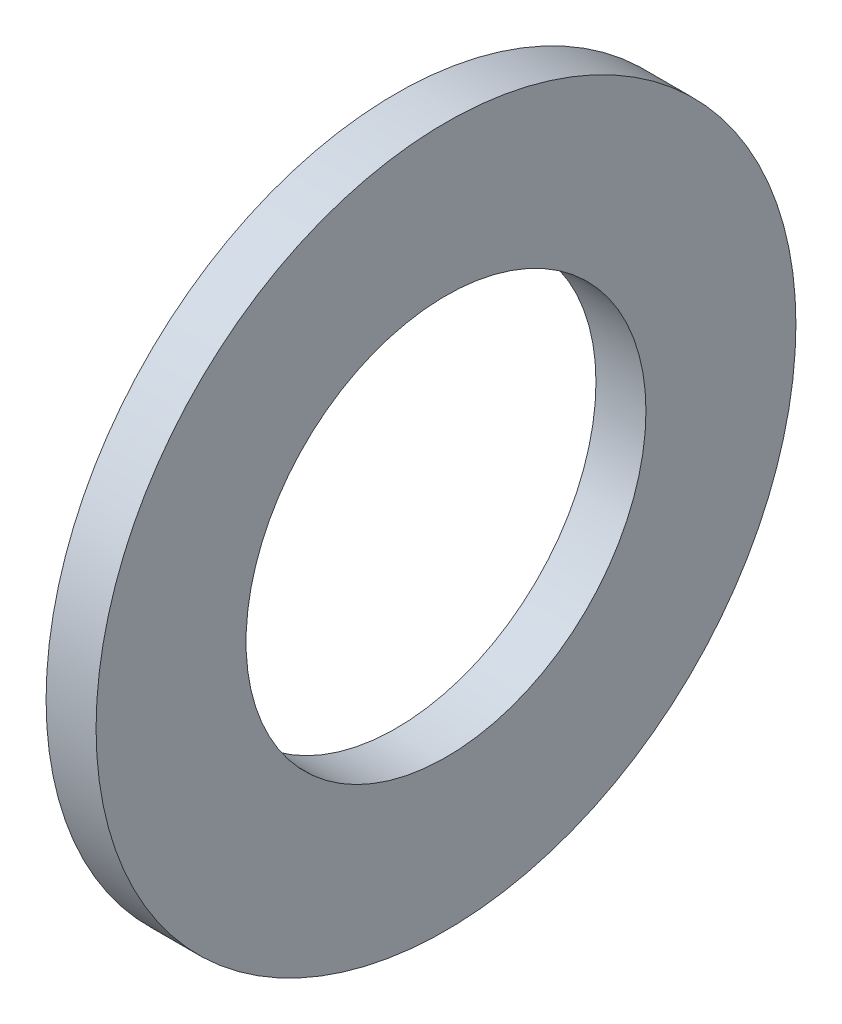
ISO-10303-21;
HEADER;
FILE_DESCRIPTION(('STEP AP214'),'2;1');
FILE_NAME('part.step','',(''),(''),'','','');
FILE_SCHEMA(('AUTOMOTIVE_DESIGN { 1 0 10303 214 1 1 1 1 }'));
ENDSEC;
DATA;
#1=APPLICATION_CONTEXT('core data for automotive mechanical design processes');
#2=APPLICATION_PROTOCOL_DEFINITION('international standard','automotive_design',2000,#1);
#3=PRODUCT_CONTEXT('',#1,'mechanical');
#4=PRODUCT('Part','Part','',(#3));
#5=PRODUCT_RELATED_PRODUCT_CATEGORY('part','',(#4));
#6=PRODUCT_DEFINITION_FORMATION('','',#4);
#7=PRODUCT_DEFINITION_CONTEXT('part definition',#1,'design');
#8=PRODUCT_DEFINITION('design','',#6,#7);
#9=PRODUCT_DEFINITION_SHAPE('','',#8);
#10=(LENGTH_UNIT() NAMED_UNIT(*) SI_UNIT(.MILLI.,.METRE.));
#11=(NAMED_UNIT(*) PLANE_ANGLE_UNIT() SI_UNIT($,.RADIAN.));
#12=(NAMED_UNIT(*) SI_UNIT($,.STERADIAN.) SOLID_ANGLE_UNIT());
#13=UNCERTAINTY_MEASURE_WITH_UNIT(LENGTH_MEASURE(1.E-05),#10,'distance_accuracy_value','');
#14=(GEOMETRIC_REPRESENTATION_CONTEXT(3) GLOBAL_UNCERTAINTY_ASSIGNED_CONTEXT((#13)) GLOBAL_UNIT_ASSIGNED_CONTEXT((#10,
#11,#12)) REPRESENTATION_CONTEXT('',''));
#15=CARTESIAN_POINT('',(0.,0.,0.));
#16=DIRECTION('',(0.,0.,1.));
#17=DIRECTION('',(1.,0.,0.));
#18=AXIS2_PLACEMENT_3D('',#15,#16,#17);
#19=CARTESIAN_POINT('',(0.5,0.,0.));
#20=DIRECTION('',(1.,0.,0.));
#21=DIRECTION('',(0.,0.,-1.));
#22=AXIS2_PLACEMENT_3D('',#19,#20,#21);
#23=PLANE('',#22);
#24=CARTESIAN_POINT('',(0.5,0.,0.));
#25=DIRECTION('',(1.,0.,0.));
#26=DIRECTION('',(0.,0.,-1.));
#27=AXIS2_PLACEMENT_3D('',#24,#25,#26);
#28=CIRCLE('',#27,3.5);
#29=CARTESIAN_POINT('',(0.5,0.,-3.5));
#30=VERTEX_POINT('',#29);
#31=EDGE_CURVE('E11',#30,#30,#28,.T.);
#32=ORIENTED_EDGE('',*,*,#31,.T.);
#33=EDGE_LOOP('',(#32));
#34=FACE_BOUND('',#33,.T.);
#35=CARTESIAN_POINT('',(0.5,0.,0.));
#36=DIRECTION('',(1.,0.,0.));
#37=DIRECTION('',(0.,0.,-1.));
#38=AXIS2_PLACEMENT_3D('',#35,#36,#37);
#39=CIRCLE('',#38,2.);
#40=CARTESIAN_POINT('',(0.5,0.,-2.));
#41=VERTEX_POINT('',#40);
#42=EDGE_CURVE('E53',#41,#41,#39,.T.);
#43=ORIENTED_EDGE('',*,*,#42,.F.);
#44=EDGE_LOOP('',(#43));
#45=FACE_BOUND('',#44,.T.);
#46=ADVANCED_FACE('F42',(#34,#45),#23,.T.);
#47=CARTESIAN_POINT('',(0.,0.,0.));
#48=DIRECTION('',(1.,0.,0.));
#49=DIRECTION('',(0.,0.,-1.));
#50=AXIS2_PLACEMENT_3D('',#47,#48,#49);
#51=PLANE('',#50);
#52=CARTESIAN_POINT('',(0.,0.,0.));
#53=DIRECTION('',(1.,0.,0.));
#54=DIRECTION('',(0.,0.,-1.));
#55=AXIS2_PLACEMENT_3D('',#52,#53,#54);
#56=CIRCLE('',#55,3.5);
#57=CARTESIAN_POINT('',(0.,0.,-3.5));
#58=VERTEX_POINT('',#57);
#59=EDGE_CURVE('E46',#58,#58,#56,.T.);
#60=ORIENTED_EDGE('',*,*,#59,.F.);
#61=EDGE_LOOP('',(#60));
#62=FACE_BOUND('',#61,.T.);
#63=CARTESIAN_POINT('',(0.,0.,0.));
#64=DIRECTION('',(1.,0.,0.));
#65=DIRECTION('',(0.,0.,-1.));
#66=AXIS2_PLACEMENT_3D('',#63,#64,#65);
#67=CIRCLE('',#66,2.);
#68=CARTESIAN_POINT('',(0.,0.,-2.));
#69=VERTEX_POINT('',#68);
#70=EDGE_CURVE('E55',#69,#69,#67,.T.);
#71=ORIENTED_EDGE('',*,*,#70,.T.);
#72=EDGE_LOOP('',(#71));
#73=FACE_BOUND('',#72,.T.);
#74=ADVANCED_FACE('F65',(#62,#73),#51,.F.);
#75=CARTESIAN_POINT('',(0.5,0.,0.));
#76=DIRECTION('',(-1.,0.,0.));
#77=DIRECTION('',(0.,0.,1.));
#78=AXIS2_PLACEMENT_3D('',#75,#76,#77);
#79=CYLINDRICAL_SURFACE('',#78,3.5);
#80=ORIENTED_EDGE('',*,*,#31,.F.);
#81=EDGE_LOOP('',(#80));
#82=FACE_BOUND('',#81,.T.);
#83=ORIENTED_EDGE('',*,*,#59,.T.);
#84=EDGE_LOOP('',(#83));
#85=FACE_BOUND('',#84,.T.);
#86=ADVANCED_FACE('F44',(#82,#85),#79,.T.);
#87=CARTESIAN_POINT('',(0.5,0.,0.));
#88=DIRECTION('',(-1.,0.,0.));
#89=DIRECTION('',(0.,0.,1.));
#90=AXIS2_PLACEMENT_3D('',#87,#88,#89);
#91=CYLINDRICAL_SURFACE('',#90,2.);
#92=ORIENTED_EDGE('',*,*,#42,.T.);
#93=EDGE_LOOP('',(#92));
#94=FACE_BOUND('',#93,.T.);
#95=ORIENTED_EDGE('',*,*,#70,.F.);
#96=EDGE_LOOP('',(#95));
#97=FACE_BOUND('',#96,.T.);
#98=ADVANCED_FACE('F61',(#94,#97),#91,.F.);
#99=CLOSED_SHELL('',(#46,#74,#86,#98));
#100=MANIFOLD_SOLID_BREP('B2',#99);
#101=ADVANCED_BREP_SHAPE_REPRESENTATION('',(#18,#100),#14);
#102=SHAPE_DEFINITION_REPRESENTATION(#9,#101);
ENDSEC;
END-ISO-10303-21;
